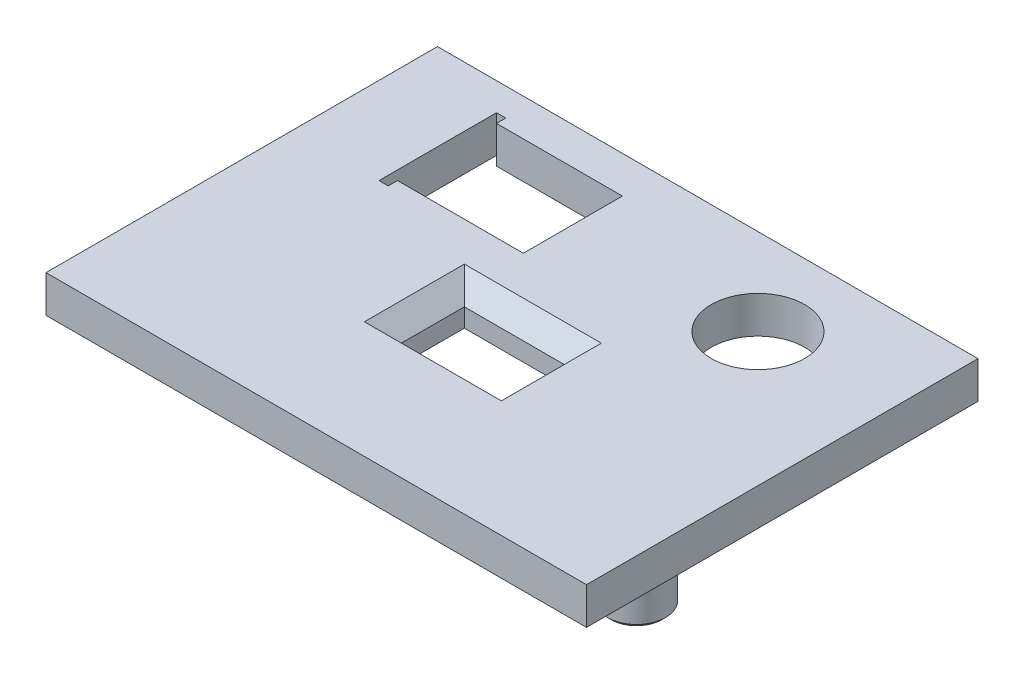
ISO-10303-21;
HEADER;
FILE_DESCRIPTION(('STEP AP214'),'2;1');
FILE_NAME('part.step','',(''),(''),'','','');
FILE_SCHEMA(('AUTOMOTIVE_DESIGN { 1 0 10303 214 1 1 1 1 }'));
ENDSEC;
DATA;
#1=APPLICATION_CONTEXT('core data for automotive mechanical design processes');
#2=APPLICATION_PROTOCOL_DEFINITION('international standard','automotive_design',2000,#1);
#3=PRODUCT_CONTEXT('',#1,'mechanical');
#4=PRODUCT('Part','Part','',(#3));
#5=PRODUCT_RELATED_PRODUCT_CATEGORY('part','',(#4));
#6=PRODUCT_DEFINITION_FORMATION('','',#4);
#7=PRODUCT_DEFINITION_CONTEXT('part definition',#1,'design');
#8=PRODUCT_DEFINITION('design','',#6,#7);
#9=PRODUCT_DEFINITION_SHAPE('','',#8);
#10=(LENGTH_UNIT() NAMED_UNIT(*) SI_UNIT(.MILLI.,.METRE.));
#11=(NAMED_UNIT(*) PLANE_ANGLE_UNIT() SI_UNIT($,.RADIAN.));
#12=(NAMED_UNIT(*) SI_UNIT($,.STERADIAN.) SOLID_ANGLE_UNIT());
#13=UNCERTAINTY_MEASURE_WITH_UNIT(LENGTH_MEASURE(1.E-05),#10,'distance_accuracy_value','');
#14=(GEOMETRIC_REPRESENTATION_CONTEXT(3) GLOBAL_UNCERTAINTY_ASSIGNED_CONTEXT((#13)) GLOBAL_UNIT_ASSIGNED_CONTEXT((#10,
#11,#12)) REPRESENTATION_CONTEXT('',''));
#15=CARTESIAN_POINT('',(0.,0.,0.));
#16=DIRECTION('',(0.,0.,1.));
#17=DIRECTION('',(1.,0.,0.));
#18=AXIS2_PLACEMENT_3D('',#15,#16,#17);
#19=CARTESIAN_POINT('',(-2.6125,-2.,-11.75));
#20=DIRECTION('',(1.,0.,0.));
#21=DIRECTION('',(0.,0.,-1.));
#22=AXIS2_PLACEMENT_3D('',#19,#20,#21);
#23=PLANE('',#22);
#24=DIRECTION('',(0.,0.,-1.));
#25=VECTOR('',#24,1.);
#26=CARTESIAN_POINT('',(-2.6125,-0.5,-11.75));
#27=LINE('',#26,#25);
#28=CARTESIAN_POINT('',(-2.61249999999998,-0.5,-6.4));
#29=VERTEX_POINT('',#28);
#30=CARTESIAN_POINT('',(-2.6125,-0.5,-11.75));
#31=VERTEX_POINT('',#30);
#32=EDGE_CURVE('E325',#29,#31,#27,.T.);
#33=ORIENTED_EDGE('',*,*,#32,.F.);
#34=DIRECTION('',(0.,1.,0.));
#35=VECTOR('',#34,1.);
#36=CARTESIAN_POINT('',(-2.6125,-2.,-6.4));
#37=LINE('',#36,#35);
#38=CARTESIAN_POINT('',(-2.6125,0.,-6.4));
#39=VERTEX_POINT('',#38);
#40=EDGE_CURVE('E436',#29,#39,#37,.T.);
#41=ORIENTED_EDGE('',*,*,#40,.T.);
#42=DIRECTION('',(0.,0.,-1.));
#43=VECTOR('',#42,1.);
#44=CARTESIAN_POINT('',(-2.6125,0.,-11.75));
#45=LINE('',#44,#43);
#46=CARTESIAN_POINT('',(-2.6125,0.,-11.75));
#47=VERTEX_POINT('',#46);
#48=EDGE_CURVE('E371',#39,#47,#45,.T.);
#49=ORIENTED_EDGE('',*,*,#48,.T.);
#50=DIRECTION('',(0.,1.,0.));
#51=VECTOR('',#50,1.);
#52=CARTESIAN_POINT('',(-2.6125,-2.,-11.75));
#53=LINE('',#52,#51);
#54=EDGE_CURVE('E432',#31,#47,#53,.T.);
#55=ORIENTED_EDGE('',*,*,#54,.F.);
#56=EDGE_LOOP('',(#33,#41,#49,#55));
#57=FACE_BOUND('',#56,.T.);
#58=ADVANCED_FACE('F47',(#57),#23,.F.);
#59=CARTESIAN_POINT('',(-14.6,-2.,7.4));
#60=DIRECTION('',(-1.,0.,0.));
#61=DIRECTION('',(0.,0.,1.));
#62=AXIS2_PLACEMENT_3D('',#59,#60,#61);
#63=PLANE('',#62);
#64=DIRECTION('',(0.,0.,1.));
#65=VECTOR('',#64,1.);
#66=CARTESIAN_POINT('',(-14.6,0.,7.4));
#67=LINE('',#66,#65);
#68=CARTESIAN_POINT('',(-14.6,0.,-13.75));
#69=VERTEX_POINT('',#68);
#70=CARTESIAN_POINT('',(-14.6,0.,7.4));
#71=VERTEX_POINT('',#70);
#72=EDGE_CURVE('E431',#69,#71,#67,.T.);
#73=ORIENTED_EDGE('',*,*,#72,.F.);
#74=DIRECTION('',(0.,1.,0.));
#75=VECTOR('',#74,1.);
#76=CARTESIAN_POINT('',(-14.6,-2.,-13.75));
#77=LINE('',#76,#75);
#78=CARTESIAN_POINT('',(-14.6,-2.,-13.75));
#79=VERTEX_POINT('',#78);
#80=EDGE_CURVE('E493',#79,#69,#77,.T.);
#81=ORIENTED_EDGE('',*,*,#80,.F.);
#82=DIRECTION('',(0.,0.,1.));
#83=VECTOR('',#82,1.);
#84=CARTESIAN_POINT('',(-14.6,-2.,7.4));
#85=LINE('',#84,#83);
#86=CARTESIAN_POINT('',(-14.6,-2.,7.4));
#87=VERTEX_POINT('',#86);
#88=EDGE_CURVE('E461',#79,#87,#85,.T.);
#89=ORIENTED_EDGE('',*,*,#88,.T.);
#90=DIRECTION('',(0.,1.,0.));
#91=VECTOR('',#90,1.);
#92=CARTESIAN_POINT('',(-14.6,-2.,7.4));
#93=LINE('',#92,#91);
#94=EDGE_CURVE('E478',#87,#71,#93,.T.);
#95=ORIENTED_EDGE('',*,*,#94,.T.);
#96=EDGE_LOOP('',(#73,#81,#89,#95));
#97=FACE_BOUND('',#96,.T.);
#98=ADVANCED_FACE('F599',(#97),#63,.T.);
#99=CARTESIAN_POINT('',(-14.6,-2.,-13.75));
#100=DIRECTION('',(0.,0.,-1.));
#101=DIRECTION('',(-1.,0.,0.));
#102=AXIS2_PLACEMENT_3D('',#99,#100,#101);
#103=PLANE('',#102);
#104=DIRECTION('',(-1.,0.,0.));
#105=VECTOR('',#104,1.);
#106=CARTESIAN_POINT('',(-14.6,0.,-13.75));
#107=LINE('',#106,#105);
#108=CARTESIAN_POINT('',(14.6,0.,-13.75));
#109=VERTEX_POINT('',#108);
#110=EDGE_CURVE('E466',#109,#69,#107,.T.);
#111=ORIENTED_EDGE('',*,*,#110,.F.);
#112=DIRECTION('',(0.,1.,0.));
#113=VECTOR('',#112,1.);
#114=CARTESIAN_POINT('',(14.6,-2.,-13.75));
#115=LINE('',#114,#113);
#116=CARTESIAN_POINT('',(14.6,-2.,-13.75));
#117=VERTEX_POINT('',#116);
#118=EDGE_CURVE('E497',#117,#109,#115,.T.);
#119=ORIENTED_EDGE('',*,*,#118,.F.);
#120=DIRECTION('',(-1.,0.,0.));
#121=VECTOR('',#120,1.);
#122=CARTESIAN_POINT('',(-14.6,-2.,-13.75));
#123=LINE('',#122,#121);
#124=EDGE_CURVE('E474',#117,#79,#123,.T.);
#125=ORIENTED_EDGE('',*,*,#124,.T.);
#126=ORIENTED_EDGE('',*,*,#80,.T.);
#127=EDGE_LOOP('',(#111,#119,#125,#126));
#128=FACE_BOUND('',#127,.T.);
#129=ADVANCED_FACE('F607',(#128),#103,.T.);
#130=CARTESIAN_POINT('',(14.6,-2.,7.4));
#131=DIRECTION('',(1.,0.,0.));
#132=DIRECTION('',(0.,0.,-1.));
#133=AXIS2_PLACEMENT_3D('',#130,#131,#132);
#134=PLANE('',#133);
#135=DIRECTION('',(0.,0.,-1.));
#136=VECTOR('',#135,1.);
#137=CARTESIAN_POINT('',(14.6,0.,7.4));
#138=LINE('',#137,#136);
#139=CARTESIAN_POINT('',(14.6,0.,7.4));
#140=VERTEX_POINT('',#139);
#141=EDGE_CURVE('E486',#140,#109,#138,.T.);
#142=ORIENTED_EDGE('',*,*,#141,.F.);
#143=DIRECTION('',(0.,1.,0.));
#144=VECTOR('',#143,1.);
#145=CARTESIAN_POINT('',(14.6,-2.,7.4));
#146=LINE('',#145,#144);
#147=CARTESIAN_POINT('',(14.6,-2.,7.4));
#148=VERTEX_POINT('',#147);
#149=EDGE_CURVE('E500',#148,#140,#146,.T.);
#150=ORIENTED_EDGE('',*,*,#149,.F.);
#151=DIRECTION('',(0.,0.,-1.));
#152=VECTOR('',#151,1.);
#153=CARTESIAN_POINT('',(14.6,-2.,7.4));
#154=LINE('',#153,#152);
#155=EDGE_CURVE('E470',#148,#117,#154,.T.);
#156=ORIENTED_EDGE('',*,*,#155,.T.);
#157=ORIENTED_EDGE('',*,*,#118,.T.);
#158=EDGE_LOOP('',(#142,#150,#156,#157));
#159=FACE_BOUND('',#158,.T.);
#160=ADVANCED_FACE('F652',(#159),#134,.T.);
#161=CARTESIAN_POINT('',(-14.6,-2.,7.4));
#162=DIRECTION('',(0.,0.,1.));
#163=DIRECTION('',(1.,0.,0.));
#164=AXIS2_PLACEMENT_3D('',#161,#162,#163);
#165=PLANE('',#164);
#166=DIRECTION('',(1.,0.,0.));
#167=VECTOR('',#166,1.);
#168=CARTESIAN_POINT('',(-14.6,0.,7.4));
#169=LINE('',#168,#167);
#170=EDGE_CURVE('E482',#71,#140,#169,.T.);
#171=ORIENTED_EDGE('',*,*,#170,.F.);
#172=ORIENTED_EDGE('',*,*,#94,.F.);
#173=DIRECTION('',(1.,0.,0.));
#174=VECTOR('',#173,1.);
#175=CARTESIAN_POINT('',(-14.6,-2.,7.4));
#176=LINE('',#175,#174);
#177=EDGE_CURVE('E465',#87,#148,#176,.T.);
#178=ORIENTED_EDGE('',*,*,#177,.T.);
#179=ORIENTED_EDGE('',*,*,#149,.T.);
#180=EDGE_LOOP('',(#171,#172,#178,#179));
#181=FACE_BOUND('',#180,.T.);
#182=ADVANCED_FACE('F647',(#181),#165,.T.);
#183=CARTESIAN_POINT('',(0.,-2.,0.));
#184=DIRECTION('',(0.,-1.,0.));
#185=DIRECTION('',(0.,0.,-1.));
#186=AXIS2_PLACEMENT_3D('',#183,#184,#185);
#187=PLANE('',#186);
#188=DIRECTION('',(0.,0.,1.));
#189=VECTOR('',#188,1.);
#190=CARTESIAN_POINT('',(7.5,-2.,4.9));
#191=LINE('',#190,#189);
#192=CARTESIAN_POINT('',(7.5,-2.,1.4));
#193=VERTEX_POINT('',#192);
#194=CARTESIAN_POINT('',(7.5,-2.,4.9));
#195=VERTEX_POINT('',#194);
#196=EDGE_CURVE('E235',#193,#195,#191,.T.);
#197=ORIENTED_EDGE('',*,*,#196,.F.);
#198=DIRECTION('',(1.,0.,0.));
#199=VECTOR('',#198,1.);
#200=CARTESIAN_POINT('',(-7.5,-2.,1.4));
#201=LINE('',#200,#199);
#202=CARTESIAN_POINT('',(-7.5,-2.,1.4));
#203=VERTEX_POINT('',#202);
#204=EDGE_CURVE('E255',#203,#193,#201,.T.);
#205=ORIENTED_EDGE('',*,*,#204,.F.);
#206=DIRECTION('',(0.,0.,-1.));
#207=VECTOR('',#206,1.);
#208=CARTESIAN_POINT('',(-7.5,-2.,4.9));
#209=LINE('',#208,#207);
#210=CARTESIAN_POINT('',(-7.5,-2.,4.9));
#211=VERTEX_POINT('',#210);
#212=EDGE_CURVE('E259',#211,#203,#209,.T.);
#213=ORIENTED_EDGE('',*,*,#212,.F.);
#214=DIRECTION('',(-1.,0.,0.));
#215=VECTOR('',#214,1.);
#216=CARTESIAN_POINT('',(-7.5,-2.,4.9));
#217=LINE('',#216,#215);
#218=EDGE_CURVE('E268',#195,#211,#217,.T.);
#219=ORIENTED_EDGE('',*,*,#218,.F.);
#220=EDGE_LOOP('',(#197,#205,#213,#219));
#221=FACE_BOUND('',#220,.T.);
#222=CARTESIAN_POINT('',(-9.9,-2.,0.));
#223=DIRECTION('',(0.,-1.,0.));
#224=DIRECTION('',(0.,0.,-1.));
#225=AXIS2_PLACEMENT_3D('',#222,#223,#224);
#226=CIRCLE('',#225,1.575);
#227=CARTESIAN_POINT('',(-9.9,-2.,-1.575));
#228=VERTEX_POINT('',#227);
#229=EDGE_CURVE('E277',#228,#228,#226,.T.);
#230=ORIENTED_EDGE('',*,*,#229,.F.);
#231=EDGE_LOOP('',(#230));
#232=FACE_BOUND('',#231,.T.);
#233=CARTESIAN_POINT('',(9.9,-2.,0.));
#234=DIRECTION('',(0.,-1.,0.));
#235=DIRECTION('',(0.,0.,-1.));
#236=AXIS2_PLACEMENT_3D('',#233,#234,#235);
#237=CIRCLE('',#236,1.575);
#238=CARTESIAN_POINT('',(9.9,-2.,-1.575));
#239=VERTEX_POINT('',#238);
#240=EDGE_CURVE('E286',#239,#239,#237,.T.);
#241=ORIENTED_EDGE('',*,*,#240,.F.);
#242=EDGE_LOOP('',(#241));
#243=FACE_BOUND('',#242,.T.);
#244=DIRECTION('',(0.,0.,1.));
#245=VECTOR('',#244,1.);
#246=CARTESIAN_POINT('',(-2.7,-2.,-3.3));
#247=LINE('',#246,#245);
#248=CARTESIAN_POINT('',(-2.7,-2.,-3.3));
#249=VERTEX_POINT('',#248);
#250=CARTESIAN_POINT('',(-2.7,-2.,0.0999999999999985));
#251=VERTEX_POINT('',#250);
#252=EDGE_CURVE('E290',#249,#251,#247,.T.);
#253=ORIENTED_EDGE('',*,*,#252,.T.);
#254=DIRECTION('',(1.,0.,0.));
#255=VECTOR('',#254,1.);
#256=CARTESIAN_POINT('',(-2.7,-2.,0.0999999999999985));
#257=LINE('',#256,#255);
#258=CARTESIAN_POINT('',(2.7,-2.,0.0999999999999986));
#259=VERTEX_POINT('',#258);
#260=EDGE_CURVE('E294',#251,#259,#257,.T.);
#261=ORIENTED_EDGE('',*,*,#260,.T.);
#262=DIRECTION('',(0.,0.,-1.));
#263=VECTOR('',#262,1.);
#264=CARTESIAN_POINT('',(2.7,-2.,0.0999999999999986));
#265=LINE('',#264,#263);
#266=CARTESIAN_POINT('',(2.7,-2.,-3.3));
#267=VERTEX_POINT('',#266);
#268=EDGE_CURVE('E298',#259,#267,#265,.T.);
#269=ORIENTED_EDGE('',*,*,#268,.T.);
#270=DIRECTION('',(-1.,0.,0.));
#271=VECTOR('',#270,1.);
#272=CARTESIAN_POINT('',(2.7,-2.,-3.3));
#273=LINE('',#272,#271);
#274=EDGE_CURVE('E302',#267,#249,#273,.T.);
#275=ORIENTED_EDGE('',*,*,#274,.T.);
#276=EDGE_LOOP('',(#253,#261,#269,#275));
#277=FACE_BOUND('',#276,.T.);
#278=DIRECTION('',(0.,0.,-1.));
#279=VECTOR('',#278,1.);
#280=CARTESIAN_POINT('',(-2.6125,-2.,-11.75));
#281=LINE('',#280,#279);
#282=CARTESIAN_POINT('',(-2.6125,-2.,-5.9));
#283=VERTEX_POINT('',#282);
#284=CARTESIAN_POINT('',(-2.6125,-2.,-6.4));
#285=VERTEX_POINT('',#284);
#286=EDGE_CURVE('E350',#283,#285,#281,.T.);
#287=ORIENTED_EDGE('',*,*,#286,.F.);
#288=DIRECTION('',(-1.,0.,0.));
#289=VECTOR('',#288,1.);
#290=CARTESIAN_POINT('',(-2.6125,-2.,-5.9));
#291=LINE('',#290,#289);
#292=CARTESIAN_POINT('',(1.3875,-2.,-5.9));
#293=VERTEX_POINT('',#292);
#294=EDGE_CURVE('E345',#293,#283,#291,.T.);
#295=ORIENTED_EDGE('',*,*,#294,.F.);
#296=DIRECTION('',(0.,0.,1.));
#297=VECTOR('',#296,1.);
#298=CARTESIAN_POINT('',(1.3875,-2.,-5.9));
#299=LINE('',#298,#297);
#300=CARTESIAN_POINT('',(1.3875,-2.,-12.25));
#301=VERTEX_POINT('',#300);
#302=EDGE_CURVE('E341',#301,#293,#299,.T.);
#303=ORIENTED_EDGE('',*,*,#302,.F.);
#304=DIRECTION('',(1.,0.,0.));
#305=VECTOR('',#304,1.);
#306=CARTESIAN_POINT('',(-2.6125,-2.,-12.25));
#307=LINE('',#306,#305);
#308=CARTESIAN_POINT('',(-2.6125,-2.,-12.25));
#309=VERTEX_POINT('',#308);
#310=EDGE_CURVE('E310',#309,#301,#307,.T.);
#311=ORIENTED_EDGE('',*,*,#310,.F.);
#312=CARTESIAN_POINT('',(-2.6125,-2.,-11.75));
#313=VERTEX_POINT('',#312);
#314=EDGE_CURVE('E349',#313,#309,#281,.T.);
#315=ORIENTED_EDGE('',*,*,#314,.F.);
#316=DIRECTION('',(-1.,0.,0.));
#317=VECTOR('',#316,1.);
#318=CARTESIAN_POINT('',(-9.4125,-2.,-11.75));
#319=LINE('',#318,#317);
#320=CARTESIAN_POINT('',(-9.4125,-2.,-11.75));
#321=VERTEX_POINT('',#320);
#322=EDGE_CURVE('E366',#313,#321,#319,.T.);
#323=ORIENTED_EDGE('',*,*,#322,.T.);
#324=DIRECTION('',(0.,0.,-1.));
#325=VECTOR('',#324,1.);
#326=CARTESIAN_POINT('',(-9.4125,-2.,-11.75));
#327=LINE('',#326,#325);
#328=CARTESIAN_POINT('',(-9.4125,-2.,-12.25));
#329=VERTEX_POINT('',#328);
#330=EDGE_CURVE('E370',#321,#329,#327,.T.);
#331=ORIENTED_EDGE('',*,*,#330,.T.);
#332=DIRECTION('',(-1.,0.,0.));
#333=VECTOR('',#332,1.);
#334=CARTESIAN_POINT('',(-9.4125,-2.,-12.25));
#335=LINE('',#334,#333);
#336=CARTESIAN_POINT('',(-9.9125,-2.,-12.25));
#337=VERTEX_POINT('',#336);
#338=EDGE_CURVE('E375',#329,#337,#335,.T.);
#339=ORIENTED_EDGE('',*,*,#338,.T.);
#340=DIRECTION('',(0.,0.,1.));
#341=VECTOR('',#340,1.);
#342=CARTESIAN_POINT('',(-9.9125,-2.,-12.25));
#343=LINE('',#342,#341);
#344=CARTESIAN_POINT('',(-9.9125,-2.,-5.9));
#345=VERTEX_POINT('',#344);
#346=EDGE_CURVE('E379',#337,#345,#343,.T.);
#347=ORIENTED_EDGE('',*,*,#346,.T.);
#348=DIRECTION('',(1.,0.,0.));
#349=VECTOR('',#348,1.);
#350=CARTESIAN_POINT('',(-9.9125,-2.,-5.9));
#351=LINE('',#350,#349);
#352=CARTESIAN_POINT('',(-9.4125,-2.,-5.9));
#353=VERTEX_POINT('',#352);
#354=EDGE_CURVE('E383',#345,#353,#351,.T.);
#355=ORIENTED_EDGE('',*,*,#354,.T.);
#356=DIRECTION('',(0.,0.,-1.));
#357=VECTOR('',#356,1.);
#358=CARTESIAN_POINT('',(-9.4125,-2.,-5.9));
#359=LINE('',#358,#357);
#360=CARTESIAN_POINT('',(-9.4125,-2.,-6.4));
#361=VERTEX_POINT('',#360);
#362=EDGE_CURVE('E387',#353,#361,#359,.T.);
#363=ORIENTED_EDGE('',*,*,#362,.T.);
#364=DIRECTION('',(1.,0.,0.));
#365=VECTOR('',#364,1.);
#366=CARTESIAN_POINT('',(-9.4125,-2.,-6.4));
#367=LINE('',#366,#365);
#368=EDGE_CURVE('E391',#361,#285,#367,.T.);
#369=ORIENTED_EDGE('',*,*,#368,.T.);
#370=EDGE_LOOP('',(#287,#295,#303,#311,#315,#323,#331,#339,#347,#355,#363,#369));
#371=FACE_BOUND('',#370,.T.);
#372=CARTESIAN_POINT('',(7.3875,-2.,-9.075));
#373=DIRECTION('',(0.,1.,0.));
#374=DIRECTION('',(0.,0.,1.));
#375=AXIS2_PLACEMENT_3D('',#372,#373,#374);
#376=CIRCLE('',#375,2.525);
#377=CARTESIAN_POINT('',(7.3875,-2.,-6.55));
#378=VERTEX_POINT('',#377);
#379=EDGE_CURVE('E356',#378,#378,#376,.T.);
#380=ORIENTED_EDGE('',*,*,#379,.T.);
#381=EDGE_LOOP('',(#380));
#382=FACE_BOUND('',#381,.T.);
#383=ORIENTED_EDGE('',*,*,#88,.F.);
#384=ORIENTED_EDGE('',*,*,#124,.F.);
#385=ORIENTED_EDGE('',*,*,#155,.F.);
#386=ORIENTED_EDGE('',*,*,#177,.F.);
#387=EDGE_LOOP('',(#383,#384,#385,#386));
#388=FACE_BOUND('',#387,.T.);
#389=ADVANCED_FACE('F579',(#221,#232,#243,#277,#371,#382,#388),#187,.T.);
#390=CARTESIAN_POINT('',(0.,0.,0.));
#391=DIRECTION('',(0.,-1.,0.));
#392=DIRECTION('',(0.,0.,-1.));
#393=AXIS2_PLACEMENT_3D('',#390,#391,#392);
#394=PLANE('',#393);
#395=DIRECTION('',(1.,0.,0.));
#396=VECTOR('',#395,1.);
#397=CARTESIAN_POINT('',(0.,0.,-4.3));
#398=LINE('',#397,#396);
#399=CARTESIAN_POINT('',(-3.7,0.,-4.3));
#400=VERTEX_POINT('',#399);
#401=CARTESIAN_POINT('',(3.7,0.,-4.3));
#402=VERTEX_POINT('',#401);
#403=EDGE_CURVE('E524',#400,#402,#398,.T.);
#404=ORIENTED_EDGE('',*,*,#403,.T.);
#405=DIRECTION('',(0.,0.,1.));
#406=VECTOR('',#405,1.);
#407=CARTESIAN_POINT('',(3.7,0.,0.));
#408=LINE('',#407,#406);
#409=CARTESIAN_POINT('',(3.7,0.,1.1));
#410=VERTEX_POINT('',#409);
#411=EDGE_CURVE('E533',#402,#410,#408,.T.);
#412=ORIENTED_EDGE('',*,*,#411,.T.);
#413=DIRECTION('',(-1.,0.,0.));
#414=VECTOR('',#413,1.);
#415=CARTESIAN_POINT('',(0.,0.,1.1));
#416=LINE('',#415,#414);
#417=CARTESIAN_POINT('',(-3.7,0.,1.1));
#418=VERTEX_POINT('',#417);
#419=EDGE_CURVE('E530',#410,#418,#416,.T.);
#420=ORIENTED_EDGE('',*,*,#419,.T.);
#421=DIRECTION('',(0.,0.,-1.));
#422=VECTOR('',#421,1.);
#423=CARTESIAN_POINT('',(-3.7,0.,0.));
#424=LINE('',#423,#422);
#425=EDGE_CURVE('E527',#418,#400,#424,.T.);
#426=ORIENTED_EDGE('',*,*,#425,.T.);
#427=EDGE_LOOP('',(#404,#412,#420,#426));
#428=FACE_BOUND('',#427,.T.);
#429=DIRECTION('',(0.,0.,-1.));
#430=VECTOR('',#429,1.);
#431=CARTESIAN_POINT('',(-9.4125,0.,-11.75));
#432=LINE('',#431,#430);
#433=CARTESIAN_POINT('',(-9.4125,0.,-11.75));
#434=VERTEX_POINT('',#433);
#435=CARTESIAN_POINT('',(-9.4125,0.,-12.25));
#436=VERTEX_POINT('',#435);
#437=EDGE_CURVE('E399',#434,#436,#432,.T.);
#438=ORIENTED_EDGE('',*,*,#437,.F.);
#439=DIRECTION('',(-1.,0.,0.));
#440=VECTOR('',#439,1.);
#441=CARTESIAN_POINT('',(-9.4125,0.,-11.75));
#442=LINE('',#441,#440);
#443=EDGE_CURVE('E396',#47,#434,#442,.T.);
#444=ORIENTED_EDGE('',*,*,#443,.F.);
#445=ORIENTED_EDGE('',*,*,#48,.F.);
#446=DIRECTION('',(1.,0.,0.));
#447=VECTOR('',#446,1.);
#448=CARTESIAN_POINT('',(-9.4125,0.,-6.4));
#449=LINE('',#448,#447);
#450=CARTESIAN_POINT('',(-9.4125,0.,-6.4));
#451=VERTEX_POINT('',#450);
#452=EDGE_CURVE('E420',#451,#39,#449,.T.);
#453=ORIENTED_EDGE('',*,*,#452,.F.);
#454=DIRECTION('',(0.,0.,-1.));
#455=VECTOR('',#454,1.);
#456=CARTESIAN_POINT('',(-9.4125,0.,-5.9));
#457=LINE('',#456,#455);
#458=CARTESIAN_POINT('',(-9.4125,0.,-5.9));
#459=VERTEX_POINT('',#458);
#460=EDGE_CURVE('E416',#459,#451,#457,.T.);
#461=ORIENTED_EDGE('',*,*,#460,.F.);
#462=DIRECTION('',(1.,0.,0.));
#463=VECTOR('',#462,1.);
#464=CARTESIAN_POINT('',(-9.9125,0.,-5.9));
#465=LINE('',#464,#463);
#466=CARTESIAN_POINT('',(-9.9125,0.,-5.9));
#467=VERTEX_POINT('',#466);
#468=EDGE_CURVE('E412',#467,#459,#465,.T.);
#469=ORIENTED_EDGE('',*,*,#468,.F.);
#470=DIRECTION('',(0.,0.,1.));
#471=VECTOR('',#470,1.);
#472=CARTESIAN_POINT('',(-9.9125,0.,-6.4));
#473=LINE('',#472,#471);
#474=CARTESIAN_POINT('',(-9.9125,0.,-12.25));
#475=VERTEX_POINT('',#474);
#476=EDGE_CURVE('E408',#475,#467,#473,.T.);
#477=ORIENTED_EDGE('',*,*,#476,.F.);
#478=DIRECTION('',(-1.,0.,0.));
#479=VECTOR('',#478,1.);
#480=CARTESIAN_POINT('',(-9.4125,0.,-12.25));
#481=LINE('',#480,#479);
#482=EDGE_CURVE('E404',#436,#475,#481,.T.);
#483=ORIENTED_EDGE('',*,*,#482,.F.);
#484=EDGE_LOOP('',(#438,#444,#445,#453,#461,#469,#477,#483));
#485=FACE_BOUND('',#484,.T.);
#486=CARTESIAN_POINT('',(7.3875,0.,-9.075));
#487=DIRECTION('',(0.,1.,0.));
#488=DIRECTION('',(0.,0.,1.));
#489=AXIS2_PLACEMENT_3D('',#486,#487,#488);
#490=CIRCLE('',#489,2.525);
#491=CARTESIAN_POINT('',(7.3875,0.,-6.55));
#492=VERTEX_POINT('',#491);
#493=EDGE_CURVE('E400',#492,#492,#490,.T.);
#494=ORIENTED_EDGE('',*,*,#493,.F.);
#495=EDGE_LOOP('',(#494));
#496=FACE_BOUND('',#495,.T.);
#497=ORIENTED_EDGE('',*,*,#72,.T.);
#498=ORIENTED_EDGE('',*,*,#170,.T.);
#499=ORIENTED_EDGE('',*,*,#141,.T.);
#500=ORIENTED_EDGE('',*,*,#110,.T.);
#501=EDGE_LOOP('',(#497,#498,#499,#500));
#502=FACE_BOUND('',#501,.T.);
#503=ADVANCED_FACE('F564',(#428,#485,#496,#502),#394,.F.);
#504=CARTESIAN_POINT('',(7.3875,-2.,-9.075));
#505=DIRECTION('',(0.,1.,0.));
#506=DIRECTION('',(0.,0.,1.));
#507=AXIS2_PLACEMENT_3D('',#504,#505,#506);
#508=CYLINDRICAL_SURFACE('',#507,2.525);
#509=ORIENTED_EDGE('',*,*,#379,.F.);
#510=EDGE_LOOP('',(#509));
#511=FACE_BOUND('',#510,.T.);
#512=ORIENTED_EDGE('',*,*,#493,.T.);
#513=EDGE_LOOP('',(#512));
#514=FACE_BOUND('',#513,.T.);
#515=ADVANCED_FACE('F640',(#511,#514),#508,.F.);
#516=CARTESIAN_POINT('',(-9.4125,-2.,-11.75));
#517=DIRECTION('',(0.,0.,-1.));
#518=DIRECTION('',(-1.,0.,0.));
#519=AXIS2_PLACEMENT_3D('',#516,#517,#518);
#520=PLANE('',#519);
#521=ORIENTED_EDGE('',*,*,#443,.T.);
#522=DIRECTION('',(0.,1.,0.));
#523=VECTOR('',#522,1.);
#524=CARTESIAN_POINT('',(-9.4125,-2.,-11.75));
#525=LINE('',#524,#523);
#526=EDGE_CURVE('E395',#321,#434,#525,.T.);
#527=ORIENTED_EDGE('',*,*,#526,.F.);
#528=ORIENTED_EDGE('',*,*,#322,.F.);
#529=EDGE_CURVE('E427',#313,#31,#53,.T.);
#530=ORIENTED_EDGE('',*,*,#529,.T.);
#531=ORIENTED_EDGE('',*,*,#54,.T.);
#532=EDGE_LOOP('',(#521,#527,#528,#530,#531));
#533=FACE_BOUND('',#532,.T.);
#534=ADVANCED_FACE('F618',(#533),#520,.F.);
#535=CARTESIAN_POINT('',(-9.4125,-2.,-6.4));
#536=DIRECTION('',(0.,0.,1.));
#537=DIRECTION('',(1.,0.,0.));
#538=AXIS2_PLACEMENT_3D('',#535,#536,#537);
#539=PLANE('',#538);
#540=ORIENTED_EDGE('',*,*,#452,.T.);
#541=ORIENTED_EDGE('',*,*,#40,.F.);
#542=EDGE_CURVE('E433',#285,#29,#37,.T.);
#543=ORIENTED_EDGE('',*,*,#542,.F.);
#544=ORIENTED_EDGE('',*,*,#368,.F.);
#545=DIRECTION('',(0.,1.,0.));
#546=VECTOR('',#545,1.);
#547=CARTESIAN_POINT('',(-9.4125,-2.,-6.4));
#548=LINE('',#547,#546);
#549=EDGE_CURVE('E437',#361,#451,#548,.T.);
#550=ORIENTED_EDGE('',*,*,#549,.T.);
#551=EDGE_LOOP('',(#540,#541,#543,#544,#550));
#552=FACE_BOUND('',#551,.T.);
#553=ADVANCED_FACE('F614',(#552),#539,.F.);
#554=CARTESIAN_POINT('',(-9.4125,-2.,-5.9));
#555=DIRECTION('',(1.,0.,0.));
#556=DIRECTION('',(0.,0.,-1.));
#557=AXIS2_PLACEMENT_3D('',#554,#555,#556);
#558=PLANE('',#557);
#559=ORIENTED_EDGE('',*,*,#460,.T.);
#560=ORIENTED_EDGE('',*,*,#549,.F.);
#561=ORIENTED_EDGE('',*,*,#362,.F.);
#562=DIRECTION('',(0.,1.,0.));
#563=VECTOR('',#562,1.);
#564=CARTESIAN_POINT('',(-9.4125,-2.,-5.9));
#565=LINE('',#564,#563);
#566=EDGE_CURVE('E440',#353,#459,#565,.T.);
#567=ORIENTED_EDGE('',*,*,#566,.T.);
#568=EDGE_LOOP('',(#559,#560,#561,#567));
#569=FACE_BOUND('',#568,.T.);
#570=ADVANCED_FACE('F617',(#569),#558,.F.);
#571=CARTESIAN_POINT('',(-9.9125,-2.,-5.9));
#572=DIRECTION('',(0.,0.,1.));
#573=DIRECTION('',(1.,0.,0.));
#574=AXIS2_PLACEMENT_3D('',#571,#572,#573);
#575=PLANE('',#574);
#576=ORIENTED_EDGE('',*,*,#468,.T.);
#577=ORIENTED_EDGE('',*,*,#566,.F.);
#578=ORIENTED_EDGE('',*,*,#354,.F.);
#579=DIRECTION('',(0.,1.,0.));
#580=VECTOR('',#579,1.);
#581=CARTESIAN_POINT('',(-9.9125,-2.,-5.9));
#582=LINE('',#581,#580);
#583=EDGE_CURVE('E443',#345,#467,#582,.T.);
#584=ORIENTED_EDGE('',*,*,#583,.T.);
#585=EDGE_LOOP('',(#576,#577,#578,#584));
#586=FACE_BOUND('',#585,.T.);
#587=ADVANCED_FACE('F622',(#586),#575,.F.);
#588=CARTESIAN_POINT('',(-9.9125,-2.,-6.4));
#589=DIRECTION('',(-1.,0.,0.));
#590=DIRECTION('',(0.,0.,1.));
#591=AXIS2_PLACEMENT_3D('',#588,#589,#590);
#592=PLANE('',#591);
#593=ORIENTED_EDGE('',*,*,#476,.T.);
#594=ORIENTED_EDGE('',*,*,#583,.F.);
#595=ORIENTED_EDGE('',*,*,#346,.F.);
#596=DIRECTION('',(0.,1.,0.));
#597=VECTOR('',#596,1.);
#598=CARTESIAN_POINT('',(-9.9125,-2.,-12.25));
#599=LINE('',#598,#597);
#600=EDGE_CURVE('E446',#337,#475,#599,.T.);
#601=ORIENTED_EDGE('',*,*,#600,.T.);
#602=EDGE_LOOP('',(#593,#594,#595,#601));
#603=FACE_BOUND('',#602,.T.);
#604=ADVANCED_FACE('F626',(#603),#592,.F.);
#605=CARTESIAN_POINT('',(-9.4125,-2.,-12.25));
#606=DIRECTION('',(0.,0.,-1.));
#607=DIRECTION('',(-1.,0.,0.));
#608=AXIS2_PLACEMENT_3D('',#605,#606,#607);
#609=PLANE('',#608);
#610=ORIENTED_EDGE('',*,*,#482,.T.);
#611=ORIENTED_EDGE('',*,*,#600,.F.);
#612=ORIENTED_EDGE('',*,*,#338,.F.);
#613=DIRECTION('',(0.,1.,0.));
#614=VECTOR('',#613,1.);
#615=CARTESIAN_POINT('',(-9.4125,-2.,-12.25));
#616=LINE('',#615,#614);
#617=EDGE_CURVE('E449',#329,#436,#616,.T.);
#618=ORIENTED_EDGE('',*,*,#617,.T.);
#619=EDGE_LOOP('',(#610,#611,#612,#618));
#620=FACE_BOUND('',#619,.T.);
#621=ADVANCED_FACE('F630',(#620),#609,.F.);
#622=CARTESIAN_POINT('',(-9.4125,-2.,-11.75));
#623=DIRECTION('',(1.,0.,0.));
#624=DIRECTION('',(0.,0.,-1.));
#625=AXIS2_PLACEMENT_3D('',#622,#623,#624);
#626=PLANE('',#625);
#627=ORIENTED_EDGE('',*,*,#437,.T.);
#628=ORIENTED_EDGE('',*,*,#617,.F.);
#629=ORIENTED_EDGE('',*,*,#330,.F.);
#630=ORIENTED_EDGE('',*,*,#526,.T.);
#631=EDGE_LOOP('',(#627,#628,#629,#630));
#632=FACE_BOUND('',#631,.T.);
#633=ADVANCED_FACE('F634',(#632),#626,.F.);
#634=CARTESIAN_POINT('',(-2.6125,-0.5,-11.75));
#635=DIRECTION('',(-1.,0.,0.));
#636=DIRECTION('',(0.,0.,1.));
#637=AXIS2_PLACEMENT_3D('',#634,#635,#636);
#638=PLANE('',#637);
#639=ORIENTED_EDGE('',*,*,#314,.T.);
#640=DIRECTION('',(0.,-1.,0.));
#641=VECTOR('',#640,1.);
#642=CARTESIAN_POINT('',(-2.6125,-0.5,-12.25));
#643=LINE('',#642,#641);
#644=CARTESIAN_POINT('',(-2.6125,-0.5,-12.25));
#645=VERTEX_POINT('',#644);
#646=EDGE_CURVE('E337',#645,#309,#643,.T.);
#647=ORIENTED_EDGE('',*,*,#646,.F.);
#648=EDGE_CURVE('E326',#31,#645,#27,.T.);
#649=ORIENTED_EDGE('',*,*,#648,.F.);
#650=ORIENTED_EDGE('',*,*,#529,.F.);
#651=EDGE_LOOP('',(#639,#647,#649,#650));
#652=FACE_BOUND('',#651,.T.);
#653=ADVANCED_FACE('F637',(#652),#638,.F.);
#654=CARTESIAN_POINT('',(-2.6125,-0.5,-5.9));
#655=VERTEX_POINT('',#654);
#656=EDGE_CURVE('E320',#655,#29,#27,.T.);
#657=ORIENTED_EDGE('',*,*,#656,.F.);
#658=DIRECTION('',(0.,-1.,0.));
#659=VECTOR('',#658,1.);
#660=CARTESIAN_POINT('',(-2.6125,-0.5,-5.9));
#661=LINE('',#660,#659);
#662=EDGE_CURVE('E353',#655,#283,#661,.T.);
#663=ORIENTED_EDGE('',*,*,#662,.T.);
#664=ORIENTED_EDGE('',*,*,#286,.T.);
#665=ORIENTED_EDGE('',*,*,#542,.T.);
#666=EDGE_LOOP('',(#657,#663,#664,#665));
#667=FACE_BOUND('',#666,.T.);
#668=ADVANCED_FACE('F779',(#667),#638,.F.);
#669=CARTESIAN_POINT('',(-2.6125,-0.5,-5.9));
#670=DIRECTION('',(0.,0.,1.));
#671=DIRECTION('',(1.,0.,0.));
#672=AXIS2_PLACEMENT_3D('',#669,#670,#671);
#673=PLANE('',#672);
#674=ORIENTED_EDGE('',*,*,#294,.T.);
#675=ORIENTED_EDGE('',*,*,#662,.F.);
#676=DIRECTION('',(-1.,0.,0.));
#677=VECTOR('',#676,1.);
#678=CARTESIAN_POINT('',(-2.6125,-0.5,-5.9));
#679=LINE('',#678,#677);
#680=CARTESIAN_POINT('',(1.3875,-0.5,-5.9));
#681=VERTEX_POINT('',#680);
#682=EDGE_CURVE('E333',#681,#655,#679,.T.);
#683=ORIENTED_EDGE('',*,*,#682,.F.);
#684=DIRECTION('',(0.,-1.,0.));
#685=VECTOR('',#684,1.);
#686=CARTESIAN_POINT('',(1.3875,-0.5,-5.9));
#687=LINE('',#686,#685);
#688=EDGE_CURVE('E357',#681,#293,#687,.T.);
#689=ORIENTED_EDGE('',*,*,#688,.T.);
#690=EDGE_LOOP('',(#674,#675,#683,#689));
#691=FACE_BOUND('',#690,.T.);
#692=ADVANCED_FACE('F769',(#691),#673,.F.);
#693=CARTESIAN_POINT('',(1.3875,-0.5,-5.9));
#694=DIRECTION('',(1.,0.,0.));
#695=DIRECTION('',(0.,0.,-1.));
#696=AXIS2_PLACEMENT_3D('',#693,#694,#695);
#697=PLANE('',#696);
#698=ORIENTED_EDGE('',*,*,#302,.T.);
#699=ORIENTED_EDGE('',*,*,#688,.F.);
#700=DIRECTION('',(0.,0.,1.));
#701=VECTOR('',#700,1.);
#702=CARTESIAN_POINT('',(1.3875,-0.5,-12.25));
#703=LINE('',#702,#701);
#704=CARTESIAN_POINT('',(1.3875,-0.5,-12.25));
#705=VERTEX_POINT('',#704);
#706=EDGE_CURVE('E330',#705,#681,#703,.T.);
#707=ORIENTED_EDGE('',*,*,#706,.F.);
#708=DIRECTION('',(0.,-1.,0.));
#709=VECTOR('',#708,1.);
#710=CARTESIAN_POINT('',(1.3875,-0.5,-12.25));
#711=LINE('',#710,#709);
#712=EDGE_CURVE('E360',#705,#301,#711,.T.);
#713=ORIENTED_EDGE('',*,*,#712,.T.);
#714=EDGE_LOOP('',(#698,#699,#707,#713));
#715=FACE_BOUND('',#714,.T.);
#716=ADVANCED_FACE('F760',(#715),#697,.F.);
#717=CARTESIAN_POINT('',(-2.6125,-0.5,-12.25));
#718=DIRECTION('',(0.,0.,-1.));
#719=DIRECTION('',(-1.,0.,0.));
#720=AXIS2_PLACEMENT_3D('',#717,#718,#719);
#721=PLANE('',#720);
#722=ORIENTED_EDGE('',*,*,#310,.T.);
#723=ORIENTED_EDGE('',*,*,#712,.F.);
#724=DIRECTION('',(1.,0.,0.));
#725=VECTOR('',#724,1.);
#726=CARTESIAN_POINT('',(-2.6125,-0.5,-12.25));
#727=LINE('',#726,#725);
#728=EDGE_CURVE('E324',#645,#705,#727,.T.);
#729=ORIENTED_EDGE('',*,*,#728,.F.);
#730=ORIENTED_EDGE('',*,*,#646,.T.);
#731=EDGE_LOOP('',(#722,#723,#729,#730));
#732=FACE_BOUND('',#731,.T.);
#733=ADVANCED_FACE('F594',(#732),#721,.F.);
#734=CARTESIAN_POINT('',(0.,-0.5,0.));
#735=DIRECTION('',(0.,-1.,0.));
#736=DIRECTION('',(0.,0.,-1.));
#737=AXIS2_PLACEMENT_3D('',#734,#735,#736);
#738=PLANE('',#737);
#739=ORIENTED_EDGE('',*,*,#656,.T.);
#740=ORIENTED_EDGE('',*,*,#32,.T.);
#741=ORIENTED_EDGE('',*,*,#648,.T.);
#742=ORIENTED_EDGE('',*,*,#728,.T.);
#743=ORIENTED_EDGE('',*,*,#706,.T.);
#744=ORIENTED_EDGE('',*,*,#682,.T.);
#745=EDGE_LOOP('',(#739,#740,#741,#742,#743,#744));
#746=FACE_BOUND('',#745,.T.);
#747=ADVANCED_FACE('F586',(#746),#738,.T.);
#748=CARTESIAN_POINT('',(-2.7,-2.,-3.3));
#749=DIRECTION('',(-1.,0.,0.));
#750=DIRECTION('',(0.,0.,1.));
#751=AXIS2_PLACEMENT_3D('',#748,#749,#750);
#752=PLANE('',#751);
#753=DIRECTION('',(0.,1.,0.));
#754=VECTOR('',#753,1.);
#755=CARTESIAN_POINT('',(-2.7,-2.,-3.3));
#756=LINE('',#755,#754);
#757=CARTESIAN_POINT('',(-2.7,-1.,-3.3));
#758=VERTEX_POINT('',#757);
#759=EDGE_CURVE('E307',#249,#758,#756,.T.);
#760=ORIENTED_EDGE('',*,*,#759,.T.);
#761=DIRECTION('',(0.,0.,1.));
#762=VECTOR('',#761,1.);
#763=CARTESIAN_POINT('',(-2.7,-1.,-3.3));
#764=LINE('',#763,#762);
#765=CARTESIAN_POINT('',(-2.7,-1.,0.0999999999999985));
#766=VERTEX_POINT('',#765);
#767=EDGE_CURVE('E58',#758,#766,#764,.T.);
#768=ORIENTED_EDGE('',*,*,#767,.T.);
#769=DIRECTION('',(0.,1.,0.));
#770=VECTOR('',#769,1.);
#771=CARTESIAN_POINT('',(-2.7,-2.,0.0999999999999985));
#772=LINE('',#771,#770);
#773=EDGE_CURVE('E306',#251,#766,#772,.T.);
#774=ORIENTED_EDGE('',*,*,#773,.F.);
#775=ORIENTED_EDGE('',*,*,#252,.F.);
#776=EDGE_LOOP('',(#760,#768,#774,#775));
#777=FACE_BOUND('',#776,.T.);
#778=ADVANCED_FACE('F584',(#777),#752,.F.);
#779=CARTESIAN_POINT('',(2.7,-2.,-3.3));
#780=DIRECTION('',(0.,0.,-1.));
#781=DIRECTION('',(-1.,0.,0.));
#782=AXIS2_PLACEMENT_3D('',#779,#780,#781);
#783=PLANE('',#782);
#784=DIRECTION('',(0.,1.,0.));
#785=VECTOR('',#784,1.);
#786=CARTESIAN_POINT('',(2.7,-2.,-3.3));
#787=LINE('',#786,#785);
#788=CARTESIAN_POINT('',(2.7,-1.,-3.3));
#789=VERTEX_POINT('',#788);
#790=EDGE_CURVE('E311',#267,#789,#787,.T.);
#791=ORIENTED_EDGE('',*,*,#790,.T.);
#792=DIRECTION('',(-1.,0.,0.));
#793=VECTOR('',#792,1.);
#794=CARTESIAN_POINT('',(2.7,-1.,-3.3));
#795=LINE('',#794,#793);
#796=EDGE_CURVE('E11',#789,#758,#795,.T.);
#797=ORIENTED_EDGE('',*,*,#796,.T.);
#798=ORIENTED_EDGE('',*,*,#759,.F.);
#799=ORIENTED_EDGE('',*,*,#274,.F.);
#800=EDGE_LOOP('',(#791,#797,#798,#799));
#801=FACE_BOUND('',#800,.T.);
#802=ADVANCED_FACE('F576',(#801),#783,.F.);
#803=CARTESIAN_POINT('',(2.7,-2.,0.0999999999999986));
#804=DIRECTION('',(1.,0.,0.));
#805=DIRECTION('',(0.,0.,-1.));
#806=AXIS2_PLACEMENT_3D('',#803,#804,#805);
#807=PLANE('',#806);
#808=DIRECTION('',(0.,1.,0.));
#809=VECTOR('',#808,1.);
#810=CARTESIAN_POINT('',(2.7,-2.,0.0999999999999986));
#811=LINE('',#810,#809);
#812=CARTESIAN_POINT('',(2.7,-1.,0.0999999999999986));
#813=VERTEX_POINT('',#812);
#814=EDGE_CURVE('E314',#259,#813,#811,.T.);
#815=ORIENTED_EDGE('',*,*,#814,.T.);
#816=DIRECTION('',(0.,0.,-1.));
#817=VECTOR('',#816,1.);
#818=CARTESIAN_POINT('',(2.7,-1.,0.0999999999999986));
#819=LINE('',#818,#817);
#820=EDGE_CURVE('E520',#813,#789,#819,.T.);
#821=ORIENTED_EDGE('',*,*,#820,.T.);
#822=ORIENTED_EDGE('',*,*,#790,.F.);
#823=ORIENTED_EDGE('',*,*,#268,.F.);
#824=EDGE_LOOP('',(#815,#821,#822,#823));
#825=FACE_BOUND('',#824,.T.);
#826=ADVANCED_FACE('F573',(#825),#807,.F.);
#827=CARTESIAN_POINT('',(-2.7,-2.,0.0999999999999985));
#828=DIRECTION('',(0.,0.,1.));
#829=DIRECTION('',(1.,0.,0.));
#830=AXIS2_PLACEMENT_3D('',#827,#828,#829);
#831=PLANE('',#830);
#832=ORIENTED_EDGE('',*,*,#773,.T.);
#833=DIRECTION('',(1.,0.,0.));
#834=VECTOR('',#833,1.);
#835=CARTESIAN_POINT('',(-2.7,-1.,0.0999999999999985));
#836=LINE('',#835,#834);
#837=EDGE_CURVE('E537',#766,#813,#836,.T.);
#838=ORIENTED_EDGE('',*,*,#837,.T.);
#839=ORIENTED_EDGE('',*,*,#814,.F.);
#840=ORIENTED_EDGE('',*,*,#260,.F.);
#841=EDGE_LOOP('',(#832,#838,#839,#840));
#842=FACE_BOUND('',#841,.T.);
#843=ADVANCED_FACE('F583',(#842),#831,.F.);
#844=CARTESIAN_POINT('',(9.9,-7.,0.));
#845=DIRECTION('',(0.,1.,0.));
#846=DIRECTION('',(0.,0.,1.));
#847=AXIS2_PLACEMENT_3D('',#844,#845,#846);
#848=CYLINDRICAL_SURFACE('',#847,1.575);
#849=CARTESIAN_POINT('',(9.9,-6.8,0.));
#850=DIRECTION('',(0.,-1.,0.));
#851=DIRECTION('',(0.,0.,-1.));
#852=AXIS2_PLACEMENT_3D('',#849,#850,#851);
#853=CIRCLE('',#852,1.575);
#854=CARTESIAN_POINT('',(9.9,-6.8,-1.575));
#855=VERTEX_POINT('',#854);
#856=EDGE_CURVE('E508',#855,#855,#853,.F.);
#857=ORIENTED_EDGE('',*,*,#856,.T.);
#858=EDGE_LOOP('',(#857));
#859=FACE_BOUND('',#858,.T.);
#860=ORIENTED_EDGE('',*,*,#240,.T.);
#861=EDGE_LOOP('',(#860));
#862=FACE_BOUND('',#861,.T.);
#863=ADVANCED_FACE('F721',(#859,#862),#848,.T.);
#864=CARTESIAN_POINT('',(9.9,-7.,0.));
#865=DIRECTION('',(0.,-1.,0.));
#866=DIRECTION('',(0.,0.,-1.));
#867=AXIS2_PLACEMENT_3D('',#864,#865,#866);
#868=PLANE('',#867);
#869=CARTESIAN_POINT('',(9.9,-7.,0.));
#870=DIRECTION('',(0.,-1.,0.));
#871=DIRECTION('',(0.,0.,-1.));
#872=AXIS2_PLACEMENT_3D('',#869,#870,#871);
#873=CIRCLE('',#872,1.375);
#874=CARTESIAN_POINT('',(9.9,-7.,-1.375));
#875=VERTEX_POINT('',#874);
#876=EDGE_CURVE('E496',#875,#875,#873,.T.);
#877=ORIENTED_EDGE('',*,*,#876,.T.);
#878=EDGE_LOOP('',(#877));
#879=FACE_BOUND('',#878,.T.);
#880=ADVANCED_FACE('F714',(#879),#868,.T.);
#881=CARTESIAN_POINT('',(-9.9,-7.,0.));
#882=DIRECTION('',(0.,1.,0.));
#883=DIRECTION('',(0.,0.,1.));
#884=AXIS2_PLACEMENT_3D('',#881,#882,#883);
#885=CYLINDRICAL_SURFACE('',#884,1.575);
#886=CARTESIAN_POINT('',(-9.9,-6.8,0.));
#887=DIRECTION('',(0.,-1.,0.));
#888=DIRECTION('',(0.,0.,-1.));
#889=AXIS2_PLACEMENT_3D('',#886,#887,#888);
#890=CIRCLE('',#889,1.575);
#891=CARTESIAN_POINT('',(-9.9,-6.8,-1.575));
#892=VERTEX_POINT('',#891);
#893=EDGE_CURVE('E516',#892,#892,#890,.F.);
#894=ORIENTED_EDGE('',*,*,#893,.T.);
#895=EDGE_LOOP('',(#894));
#896=FACE_BOUND('',#895,.T.);
#897=ORIENTED_EDGE('',*,*,#229,.T.);
#898=EDGE_LOOP('',(#897));
#899=FACE_BOUND('',#898,.T.);
#900=ADVANCED_FACE('F711',(#896,#899),#885,.T.);
#901=CARTESIAN_POINT('',(-9.9,-7.,0.));
#902=DIRECTION('',(0.,-1.,0.));
#903=DIRECTION('',(0.,0.,-1.));
#904=AXIS2_PLACEMENT_3D('',#901,#902,#903);
#905=PLANE('',#904);
#906=CARTESIAN_POINT('',(-9.9,-7.,0.));
#907=DIRECTION('',(0.,-1.,0.));
#908=DIRECTION('',(0.,0.,-1.));
#909=AXIS2_PLACEMENT_3D('',#906,#907,#908);
#910=CIRCLE('',#909,1.375);
#911=CARTESIAN_POINT('',(-9.9,-7.,-1.375));
#912=VERTEX_POINT('',#911);
#913=EDGE_CURVE('E512',#912,#912,#910,.T.);
#914=ORIENTED_EDGE('',*,*,#913,.T.);
#915=EDGE_LOOP('',(#914));
#916=FACE_BOUND('',#915,.T.);
#917=ADVANCED_FACE('F668',(#916),#905,.T.);
#918=CARTESIAN_POINT('',(9.9,-7.,0.));
#919=DIRECTION('',(0.,1.,0.));
#920=DIRECTION('',(0.,0.,1.));
#921=AXIS2_PLACEMENT_3D('',#918,#919,#920);
#922=CONICAL_SURFACE('',#921,1.375,0.785398163397452);
#923=ORIENTED_EDGE('',*,*,#856,.F.);
#924=EDGE_LOOP('',(#923));
#925=FACE_BOUND('',#924,.T.);
#926=ORIENTED_EDGE('',*,*,#876,.F.);
#927=EDGE_LOOP('',(#926));
#928=FACE_BOUND('',#927,.T.);
#929=ADVANCED_FACE('F661',(#925,#928),#922,.T.);
#930=CARTESIAN_POINT('',(-9.9,-7.,0.));
#931=DIRECTION('',(0.,1.,0.));
#932=DIRECTION('',(0.,0.,1.));
#933=AXIS2_PLACEMENT_3D('',#930,#931,#932);
#934=CONICAL_SURFACE('',#933,1.375,0.785398163397452);
#935=ORIENTED_EDGE('',*,*,#893,.F.);
#936=EDGE_LOOP('',(#935));
#937=FACE_BOUND('',#936,.T.);
#938=ORIENTED_EDGE('',*,*,#913,.F.);
#939=EDGE_LOOP('',(#938));
#940=FACE_BOUND('',#939,.T.);
#941=ADVANCED_FACE('F667',(#937,#940),#934,.T.);
#942=CARTESIAN_POINT('',(7.5,-1.,4.9));
#943=DIRECTION('',(1.,0.,0.));
#944=DIRECTION('',(0.,0.,-1.));
#945=AXIS2_PLACEMENT_3D('',#942,#943,#944);
#946=PLANE('',#945);
#947=ORIENTED_EDGE('',*,*,#196,.T.);
#948=DIRECTION('',(0.,-1.,0.));
#949=VECTOR('',#948,1.);
#950=CARTESIAN_POINT('',(7.5,-1.,4.9));
#951=LINE('',#950,#949);
#952=CARTESIAN_POINT('',(7.5,-1.,4.9));
#953=VERTEX_POINT('',#952);
#954=EDGE_CURVE('E228',#953,#195,#951,.T.);
#955=ORIENTED_EDGE('',*,*,#954,.F.);
#956=DIRECTION('',(0.,0.,1.));
#957=VECTOR('',#956,1.);
#958=CARTESIAN_POINT('',(7.5,-1.,4.9));
#959=LINE('',#958,#957);
#960=CARTESIAN_POINT('',(7.5,-1.,1.4));
#961=VERTEX_POINT('',#960);
#962=EDGE_CURVE('E232',#961,#953,#959,.T.);
#963=ORIENTED_EDGE('',*,*,#962,.F.);
#964=DIRECTION('',(0.,-1.,0.));
#965=VECTOR('',#964,1.);
#966=CARTESIAN_POINT('',(7.5,-1.,1.4));
#967=LINE('',#966,#965);
#968=EDGE_CURVE('E274',#961,#193,#967,.T.);
#969=ORIENTED_EDGE('',*,*,#968,.T.);
#970=EDGE_LOOP('',(#947,#955,#963,#969));
#971=FACE_BOUND('',#970,.T.);
#972=ADVANCED_FACE('F230',(#971),#946,.F.);
#973=CARTESIAN_POINT('',(-7.5,-1.,1.4));
#974=DIRECTION('',(0.,0.,-1.));
#975=DIRECTION('',(-1.,0.,0.));
#976=AXIS2_PLACEMENT_3D('',#973,#974,#975);
#977=PLANE('',#976);
#978=ORIENTED_EDGE('',*,*,#204,.T.);
#979=ORIENTED_EDGE('',*,*,#968,.F.);
#980=DIRECTION('',(1.,0.,0.));
#981=VECTOR('',#980,1.);
#982=CARTESIAN_POINT('',(-7.5,-1.,1.4));
#983=LINE('',#982,#981);
#984=CARTESIAN_POINT('',(-7.5,-1.,1.4));
#985=VERTEX_POINT('',#984);
#986=EDGE_CURVE('E241',#985,#961,#983,.T.);
#987=ORIENTED_EDGE('',*,*,#986,.F.);
#988=DIRECTION('',(0.,-1.,0.));
#989=VECTOR('',#988,1.);
#990=CARTESIAN_POINT('',(-7.5,-1.,1.4));
#991=LINE('',#990,#989);
#992=EDGE_CURVE('E278',#985,#203,#991,.T.);
#993=ORIENTED_EDGE('',*,*,#992,.T.);
#994=EDGE_LOOP('',(#978,#979,#987,#993));
#995=FACE_BOUND('',#994,.T.);
#996=ADVANCED_FACE('F702',(#995),#977,.F.);
#997=CARTESIAN_POINT('',(-7.5,-1.,4.9));
#998=DIRECTION('',(-1.,0.,0.));
#999=DIRECTION('',(0.,0.,1.));
#1000=AXIS2_PLACEMENT_3D('',#997,#998,#999);
#1001=PLANE('',#1000);
#1002=ORIENTED_EDGE('',*,*,#212,.T.);
#1003=ORIENTED_EDGE('',*,*,#992,.F.);
#1004=DIRECTION('',(0.,0.,-1.));
#1005=VECTOR('',#1004,1.);
#1006=CARTESIAN_POINT('',(-7.5,-1.,4.9));
#1007=LINE('',#1006,#1005);
#1008=CARTESIAN_POINT('',(-7.5,-1.,4.9));
#1009=VERTEX_POINT('',#1008);
#1010=EDGE_CURVE('E250',#1009,#985,#1007,.T.);
#1011=ORIENTED_EDGE('',*,*,#1010,.F.);
#1012=DIRECTION('',(0.,-1.,0.));
#1013=VECTOR('',#1012,1.);
#1014=CARTESIAN_POINT('',(-7.5,-1.,4.9));
#1015=LINE('',#1014,#1013);
#1016=EDGE_CURVE('E240',#1009,#211,#1015,.T.);
#1017=ORIENTED_EDGE('',*,*,#1016,.T.);
#1018=EDGE_LOOP('',(#1002,#1003,#1011,#1017));
#1019=FACE_BOUND('',#1018,.T.);
#1020=ADVANCED_FACE('F699',(#1019),#1001,.F.);
#1021=CARTESIAN_POINT('',(-7.5,-1.,4.9));
#1022=DIRECTION('',(0.,0.,1.));
#1023=DIRECTION('',(1.,0.,0.));
#1024=AXIS2_PLACEMENT_3D('',#1021,#1022,#1023);
#1025=PLANE('',#1024);
#1026=ORIENTED_EDGE('',*,*,#218,.T.);
#1027=ORIENTED_EDGE('',*,*,#1016,.F.);
#1028=DIRECTION('',(-1.,0.,0.));
#1029=VECTOR('',#1028,1.);
#1030=CARTESIAN_POINT('',(-7.5,-1.,4.9));
#1031=LINE('',#1030,#1029);
#1032=EDGE_CURVE('E244',#953,#1009,#1031,.T.);
#1033=ORIENTED_EDGE('',*,*,#1032,.F.);
#1034=ORIENTED_EDGE('',*,*,#954,.T.);
#1035=EDGE_LOOP('',(#1026,#1027,#1033,#1034));
#1036=FACE_BOUND('',#1035,.T.);
#1037=ADVANCED_FACE('F245',(#1036),#1025,.F.);
#1038=CARTESIAN_POINT('',(0.,-1.,0.));
#1039=DIRECTION('',(0.,-1.,0.));
#1040=DIRECTION('',(0.,0.,-1.));
#1041=AXIS2_PLACEMENT_3D('',#1038,#1039,#1040);
#1042=PLANE('',#1041);
#1043=ORIENTED_EDGE('',*,*,#962,.T.);
#1044=ORIENTED_EDGE('',*,*,#1032,.T.);
#1045=ORIENTED_EDGE('',*,*,#1010,.T.);
#1046=ORIENTED_EDGE('',*,*,#986,.T.);
#1047=EDGE_LOOP('',(#1043,#1044,#1045,#1046));
#1048=FACE_BOUND('',#1047,.T.);
#1049=ADVANCED_FACE('F252',(#1048),#1042,.T.);
#1050=CARTESIAN_POINT('',(-2.7,-1.,-3.3));
#1051=DIRECTION('',(-0.707106781186548,-0.707106781186547,0.));
#1052=DIRECTION('',(0.,0.,1.));
#1053=AXIS2_PLACEMENT_3D('',#1050,#1051,#1052);
#1054=PLANE('',#1053);
#1055=DIRECTION('',(0.577350269189626,-0.577350269189626,0.577350269189626));
#1056=VECTOR('',#1055,1.);
#1057=CARTESIAN_POINT('',(-2.7,-1.,-3.3));
#1058=LINE('',#1057,#1056);
#1059=EDGE_CURVE('E547',#400,#758,#1058,.T.);
#1060=ORIENTED_EDGE('',*,*,#1059,.F.);
#1061=ORIENTED_EDGE('',*,*,#425,.F.);
#1062=DIRECTION('',(0.577350269189626,-0.577350269189626,-0.577350269189626));
#1063=VECTOR('',#1062,1.);
#1064=CARTESIAN_POINT('',(-2.7,-1.,0.0999999999999985));
#1065=LINE('',#1064,#1063);
#1066=EDGE_CURVE('E52',#766,#418,#1065,.F.);
#1067=ORIENTED_EDGE('',*,*,#1066,.F.);
#1068=ORIENTED_EDGE('',*,*,#767,.F.);
#1069=EDGE_LOOP('',(#1060,#1061,#1067,#1068));
#1070=FACE_BOUND('',#1069,.T.);
#1071=ADVANCED_FACE('F50',(#1070),#1054,.F.);
#1072=CARTESIAN_POINT('',(-2.7,-1.,0.0999999999999985));
#1073=DIRECTION('',(0.,-0.707106781186547,0.707106781186547));
#1074=DIRECTION('',(1.,0.,0.));
#1075=AXIS2_PLACEMENT_3D('',#1072,#1073,#1074);
#1076=PLANE('',#1075);
#1077=ORIENTED_EDGE('',*,*,#1066,.T.);
#1078=ORIENTED_EDGE('',*,*,#419,.F.);
#1079=DIRECTION('',(-0.577350269189626,-0.577350269189626,-0.577350269189626));
#1080=VECTOR('',#1079,1.);
#1081=CARTESIAN_POINT('',(2.7,-1.,0.0999999999999986));
#1082=LINE('',#1081,#1080);
#1083=EDGE_CURVE('E545',#813,#410,#1082,.F.);
#1084=ORIENTED_EDGE('',*,*,#1083,.F.);
#1085=ORIENTED_EDGE('',*,*,#837,.F.);
#1086=EDGE_LOOP('',(#1077,#1078,#1084,#1085));
#1087=FACE_BOUND('',#1086,.T.);
#1088=ADVANCED_FACE('F559',(#1087),#1076,.F.);
#1089=CARTESIAN_POINT('',(2.7,-1.,-3.3));
#1090=DIRECTION('',(0.,-0.707106781186547,-0.707106781186548));
#1091=DIRECTION('',(-1.,0.,0.));
#1092=AXIS2_PLACEMENT_3D('',#1089,#1090,#1091);
#1093=PLANE('',#1092);
#1094=ORIENTED_EDGE('',*,*,#1059,.T.);
#1095=ORIENTED_EDGE('',*,*,#796,.F.);
#1096=DIRECTION('',(0.577350269189626,0.577350269189626,-0.577350269189626));
#1097=VECTOR('',#1096,1.);
#1098=CARTESIAN_POINT('',(1.56666666666667,-2.13333333333333,-2.16666666666667));
#1099=LINE('',#1098,#1097);
#1100=EDGE_CURVE('E542',#402,#789,#1099,.F.);
#1101=ORIENTED_EDGE('',*,*,#1100,.F.);
#1102=ORIENTED_EDGE('',*,*,#403,.F.);
#1103=EDGE_LOOP('',(#1094,#1095,#1101,#1102));
#1104=FACE_BOUND('',#1103,.T.);
#1105=ADVANCED_FACE('F571',(#1104),#1093,.F.);
#1106=CARTESIAN_POINT('',(2.7,-1.,0.0999999999999986));
#1107=DIRECTION('',(0.707106781186547,-0.707106781186547,0.));
#1108=DIRECTION('',(0.,0.,-1.));
#1109=AXIS2_PLACEMENT_3D('',#1106,#1107,#1108);
#1110=PLANE('',#1109);
#1111=ORIENTED_EDGE('',*,*,#1083,.T.);
#1112=ORIENTED_EDGE('',*,*,#411,.F.);
#1113=ORIENTED_EDGE('',*,*,#1100,.T.);
#1114=ORIENTED_EDGE('',*,*,#820,.F.);
#1115=EDGE_LOOP('',(#1111,#1112,#1113,#1114));
#1116=FACE_BOUND('',#1115,.T.);
#1117=ADVANCED_FACE('F569',(#1116),#1110,.F.);
#1118=CLOSED_SHELL('',(#58,#98,#129,#160,#182,#389,#503,#515,#534,#553,#570,#587,#604,#621,#633,
#653,#668,#692,#716,#733,#747,#778,#802,#826,#843,#863,#880,#900,#917,#929,#941,#972,#996,#1020,
#1037,#1049,#1071,#1088,#1105,#1117));
#1119=MANIFOLD_SOLID_BREP('B2',#1118);
#1120=ADVANCED_BREP_SHAPE_REPRESENTATION('',(#18,#1119),#14);
#1121=SHAPE_DEFINITION_REPRESENTATION(#9,#1120);
ENDSEC;
END-ISO-10303-21;
